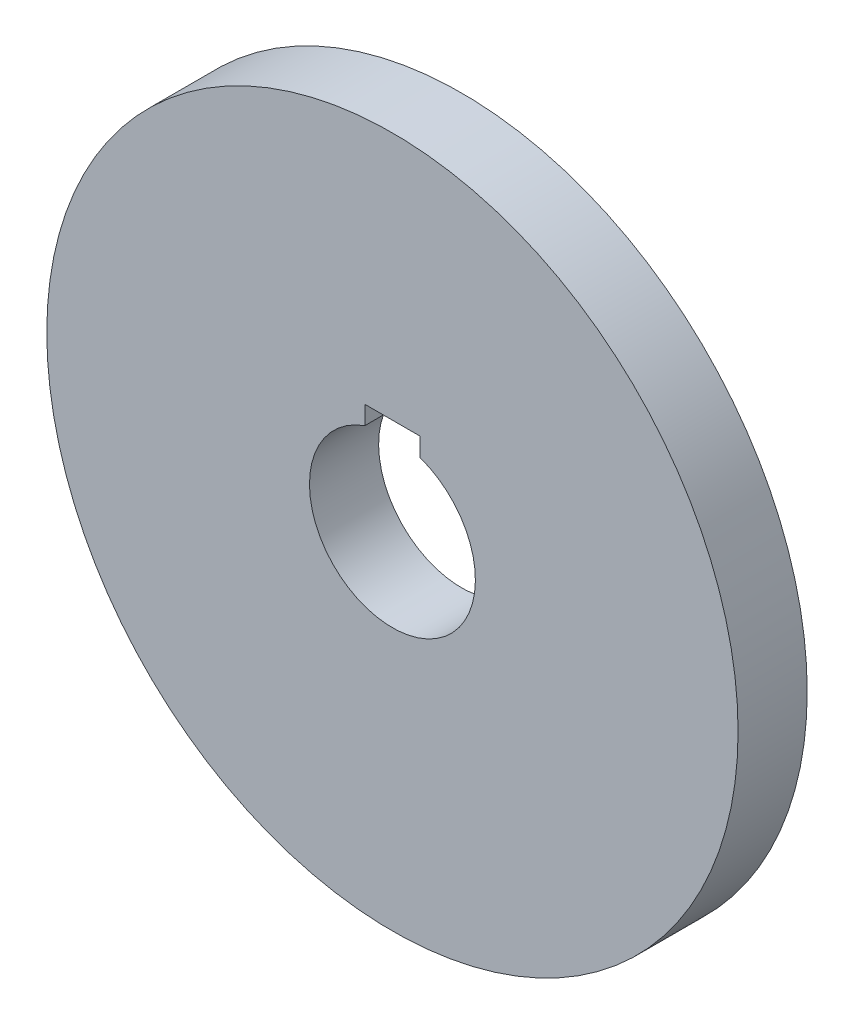
ISO-10303-21;
HEADER;
FILE_DESCRIPTION(('STEP AP214'),'2;1');
FILE_NAME('part.step','',(''),(''),'','','');
FILE_SCHEMA(('AUTOMOTIVE_DESIGN { 1 0 10303 214 1 1 1 1 }'));
ENDSEC;
DATA;
#1=APPLICATION_CONTEXT('core data for automotive mechanical design processes');
#2=APPLICATION_PROTOCOL_DEFINITION('international standard','automotive_design',2000,#1);
#3=PRODUCT_CONTEXT('',#1,'mechanical');
#4=PRODUCT('Part','Part','',(#3));
#5=PRODUCT_RELATED_PRODUCT_CATEGORY('part','',(#4));
#6=PRODUCT_DEFINITION_FORMATION('','',#4);
#7=PRODUCT_DEFINITION_CONTEXT('part definition',#1,'design');
#8=PRODUCT_DEFINITION('design','',#6,#7);
#9=PRODUCT_DEFINITION_SHAPE('','',#8);
#10=(LENGTH_UNIT() NAMED_UNIT(*) SI_UNIT(.MILLI.,.METRE.));
#11=(NAMED_UNIT(*) PLANE_ANGLE_UNIT() SI_UNIT($,.RADIAN.));
#12=(NAMED_UNIT(*) SI_UNIT($,.STERADIAN.) SOLID_ANGLE_UNIT());
#13=UNCERTAINTY_MEASURE_WITH_UNIT(LENGTH_MEASURE(1.E-05),#10,'distance_accuracy_value','');
#14=(GEOMETRIC_REPRESENTATION_CONTEXT(3) GLOBAL_UNCERTAINTY_ASSIGNED_CONTEXT((#13)) GLOBAL_UNIT_ASSIGNED_CONTEXT((#10,
#11,#12)) REPRESENTATION_CONTEXT('',''));
#15=CARTESIAN_POINT('',(0.,0.,0.));
#16=DIRECTION('',(0.,0.,1.));
#17=DIRECTION('',(1.,0.,0.));
#18=AXIS2_PLACEMENT_3D('',#15,#16,#17);
#19=CARTESIAN_POINT('',(0.,0.,5.));
#20=DIRECTION('',(0.,0.,1.));
#21=DIRECTION('',(1.,0.,0.));
#22=AXIS2_PLACEMENT_3D('',#19,#20,#21);
#23=PLANE('',#22);
#24=DIRECTION('',(0.,1.,0.));
#25=VECTOR('',#24,1.);
#26=CARTESIAN_POINT('',(2.,7.,5.));
#27=LINE('',#26,#25);
#28=CARTESIAN_POINT('',(2.,5.65685424949238,5.));
#29=VERTEX_POINT('',#28);
#30=CARTESIAN_POINT('',(2.,7.,5.));
#31=VERTEX_POINT('',#30);
#32=EDGE_CURVE('E77',#29,#31,#27,.T.);
#33=ORIENTED_EDGE('',*,*,#32,.F.);
#34=CARTESIAN_POINT('',(0.,0.,5.));
#35=DIRECTION('',(0.,0.,1.));
#36=DIRECTION('',(1.,0.,0.));
#37=AXIS2_PLACEMENT_3D('',#34,#35,#36);
#38=CIRCLE('',#37,6.);
#39=CARTESIAN_POINT('',(-2.,5.65685424949238,5.));
#40=VERTEX_POINT('',#39);
#41=EDGE_CURVE('E102',#40,#29,#38,.T.);
#42=ORIENTED_EDGE('',*,*,#41,.F.);
#43=DIRECTION('',(0.,-1.,0.));
#44=VECTOR('',#43,1.);
#45=CARTESIAN_POINT('',(-2.,7.,5.));
#46=LINE('',#45,#44);
#47=CARTESIAN_POINT('',(-2.,7.,5.));
#48=VERTEX_POINT('',#47);
#49=EDGE_CURVE('E48',#48,#40,#46,.T.);
#50=ORIENTED_EDGE('',*,*,#49,.F.);
#51=DIRECTION('',(-1.,0.,0.));
#52=VECTOR('',#51,1.);
#53=CARTESIAN_POINT('',(-2.,7.,5.));
#54=LINE('',#53,#52);
#55=EDGE_CURVE('E95',#31,#48,#54,.T.);
#56=ORIENTED_EDGE('',*,*,#55,.F.);
#57=EDGE_LOOP('',(#33,#42,#50,#56));
#58=FACE_BOUND('',#57,.T.);
#59=CARTESIAN_POINT('',(0.,0.,5.));
#60=DIRECTION('',(0.,0.,1.));
#61=DIRECTION('',(1.,0.,0.));
#62=AXIS2_PLACEMENT_3D('',#59,#60,#61);
#63=CIRCLE('',#62,25.);
#64=CARTESIAN_POINT('',(25.,0.,5.));
#65=VERTEX_POINT('',#64);
#66=EDGE_CURVE('E107',#65,#65,#63,.T.);
#67=ORIENTED_EDGE('',*,*,#66,.T.);
#68=EDGE_LOOP('',(#67));
#69=FACE_BOUND('',#68,.T.);
#70=ADVANCED_FACE('F33',(#58,#69),#23,.T.);
#71=CARTESIAN_POINT('',(0.,0.,0.));
#72=DIRECTION('',(0.,0.,1.));
#73=DIRECTION('',(1.,0.,0.));
#74=AXIS2_PLACEMENT_3D('',#71,#72,#73);
#75=PLANE('',#74);
#76=CARTESIAN_POINT('',(0.,0.,0.));
#77=DIRECTION('',(0.,0.,1.));
#78=DIRECTION('',(1.,0.,0.));
#79=AXIS2_PLACEMENT_3D('',#76,#77,#78);
#80=CIRCLE('',#79,6.);
#81=CARTESIAN_POINT('',(-2.,5.65685424949238,0.));
#82=VERTEX_POINT('',#81);
#83=CARTESIAN_POINT('',(2.,5.65685424949238,0.));
#84=VERTEX_POINT('',#83);
#85=EDGE_CURVE('E93',#82,#84,#80,.T.);
#86=ORIENTED_EDGE('',*,*,#85,.T.);
#87=DIRECTION('',(0.,1.,0.));
#88=VECTOR('',#87,1.);
#89=CARTESIAN_POINT('',(2.,7.,0.));
#90=LINE('',#89,#88);
#91=CARTESIAN_POINT('',(2.,7.,0.));
#92=VERTEX_POINT('',#91);
#93=EDGE_CURVE('E74',#84,#92,#90,.T.);
#94=ORIENTED_EDGE('',*,*,#93,.T.);
#95=DIRECTION('',(-1.,0.,0.));
#96=VECTOR('',#95,1.);
#97=CARTESIAN_POINT('',(-2.,7.,0.));
#98=LINE('',#97,#96);
#99=CARTESIAN_POINT('',(-2.,7.,0.));
#100=VERTEX_POINT('',#99);
#101=EDGE_CURVE('E85',#92,#100,#98,.T.);
#102=ORIENTED_EDGE('',*,*,#101,.T.);
#103=DIRECTION('',(0.,-1.,0.));
#104=VECTOR('',#103,1.);
#105=CARTESIAN_POINT('',(-2.,7.,0.));
#106=LINE('',#105,#104);
#107=EDGE_CURVE('E82',#100,#82,#106,.T.);
#108=ORIENTED_EDGE('',*,*,#107,.T.);
#109=EDGE_LOOP('',(#86,#94,#102,#108));
#110=FACE_BOUND('',#109,.T.);
#111=CARTESIAN_POINT('',(0.,0.,0.));
#112=DIRECTION('',(0.,0.,1.));
#113=DIRECTION('',(1.,0.,0.));
#114=AXIS2_PLACEMENT_3D('',#111,#112,#113);
#115=CIRCLE('',#114,25.);
#116=CARTESIAN_POINT('',(25.,0.,0.));
#117=VERTEX_POINT('',#116);
#118=EDGE_CURVE('E105',#117,#117,#115,.T.);
#119=ORIENTED_EDGE('',*,*,#118,.F.);
#120=EDGE_LOOP('',(#119));
#121=FACE_BOUND('',#120,.T.);
#122=ADVANCED_FACE('F90',(#110,#121),#75,.F.);
#123=CARTESIAN_POINT('',(0.,0.,5.));
#124=DIRECTION('',(0.,0.,-1.));
#125=DIRECTION('',(-1.,0.,0.));
#126=AXIS2_PLACEMENT_3D('',#123,#124,#125);
#127=CYLINDRICAL_SURFACE('',#126,25.);
#128=ORIENTED_EDGE('',*,*,#66,.F.);
#129=EDGE_LOOP('',(#128));
#130=FACE_BOUND('',#129,.T.);
#131=ORIENTED_EDGE('',*,*,#118,.T.);
#132=EDGE_LOOP('',(#131));
#133=FACE_BOUND('',#132,.T.);
#134=ADVANCED_FACE('F35',(#130,#133),#127,.T.);
#135=CARTESIAN_POINT('',(0.,0.,5.));
#136=DIRECTION('',(0.,0.,-1.));
#137=DIRECTION('',(-1.,0.,0.));
#138=AXIS2_PLACEMENT_3D('',#135,#136,#137);
#139=CYLINDRICAL_SURFACE('',#138,6.);
#140=DIRECTION('',(0.,0.,-1.));
#141=VECTOR('',#140,1.);
#142=CARTESIAN_POINT('',(2.,5.65685424949238,5.));
#143=LINE('',#142,#141);
#144=EDGE_CURVE('E11',#84,#29,#143,.F.);
#145=ORIENTED_EDGE('',*,*,#144,.F.);
#146=ORIENTED_EDGE('',*,*,#85,.F.);
#147=DIRECTION('',(0.,0.,-1.));
#148=VECTOR('',#147,1.);
#149=CARTESIAN_POINT('',(-2.,5.65685424949238,5.));
#150=LINE('',#149,#148);
#151=EDGE_CURVE('E41',#40,#82,#150,.T.);
#152=ORIENTED_EDGE('',*,*,#151,.F.);
#153=ORIENTED_EDGE('',*,*,#41,.T.);
#154=EDGE_LOOP('',(#145,#146,#152,#153));
#155=FACE_BOUND('',#154,.T.);
#156=ADVANCED_FACE('F118',(#155),#139,.F.);
#157=CARTESIAN_POINT('',(2.,7.,0.));
#158=DIRECTION('',(1.,0.,0.));
#159=DIRECTION('',(0.,0.,-1.));
#160=AXIS2_PLACEMENT_3D('',#157,#158,#159);
#161=PLANE('',#160);
#162=ORIENTED_EDGE('',*,*,#144,.T.);
#163=ORIENTED_EDGE('',*,*,#32,.T.);
#164=DIRECTION('',(0.,0.,1.));
#165=VECTOR('',#164,1.);
#166=CARTESIAN_POINT('',(2.,7.,0.));
#167=LINE('',#166,#165);
#168=EDGE_CURVE('E70',#92,#31,#167,.T.);
#169=ORIENTED_EDGE('',*,*,#168,.F.);
#170=ORIENTED_EDGE('',*,*,#93,.F.);
#171=EDGE_LOOP('',(#162,#163,#169,#170));
#172=FACE_BOUND('',#171,.T.);
#173=ADVANCED_FACE('F72',(#172),#161,.F.);
#174=CARTESIAN_POINT('',(-2.,7.,0.));
#175=DIRECTION('',(-1.,0.,0.));
#176=DIRECTION('',(0.,0.,1.));
#177=AXIS2_PLACEMENT_3D('',#174,#175,#176);
#178=PLANE('',#177);
#179=ORIENTED_EDGE('',*,*,#151,.T.);
#180=ORIENTED_EDGE('',*,*,#107,.F.);
#181=DIRECTION('',(0.,0.,1.));
#182=VECTOR('',#181,1.);
#183=CARTESIAN_POINT('',(-2.,7.,0.));
#184=LINE('',#183,#182);
#185=EDGE_CURVE('E81',#100,#48,#184,.T.);
#186=ORIENTED_EDGE('',*,*,#185,.T.);
#187=ORIENTED_EDGE('',*,*,#49,.T.);
#188=EDGE_LOOP('',(#179,#180,#186,#187));
#189=FACE_BOUND('',#188,.T.);
#190=ADVANCED_FACE('F128',(#189),#178,.F.);
#191=CARTESIAN_POINT('',(-2.,7.,0.));
#192=DIRECTION('',(0.,1.,0.));
#193=DIRECTION('',(0.,0.,1.));
#194=AXIS2_PLACEMENT_3D('',#191,#192,#193);
#195=PLANE('',#194);
#196=ORIENTED_EDGE('',*,*,#55,.T.);
#197=ORIENTED_EDGE('',*,*,#185,.F.);
#198=ORIENTED_EDGE('',*,*,#101,.F.);
#199=ORIENTED_EDGE('',*,*,#168,.T.);
#200=EDGE_LOOP('',(#196,#197,#198,#199));
#201=FACE_BOUND('',#200,.T.);
#202=ADVANCED_FACE('F86',(#201),#195,.F.);
#203=CLOSED_SHELL('',(#70,#122,#134,#156,#173,#190,#202));
#204=MANIFOLD_SOLID_BREP('B2',#203);
#205=ADVANCED_BREP_SHAPE_REPRESENTATION('',(#18,#204),#14);
#206=SHAPE_DEFINITION_REPRESENTATION(#9,#205);
ENDSEC;
END-ISO-10303-21;
